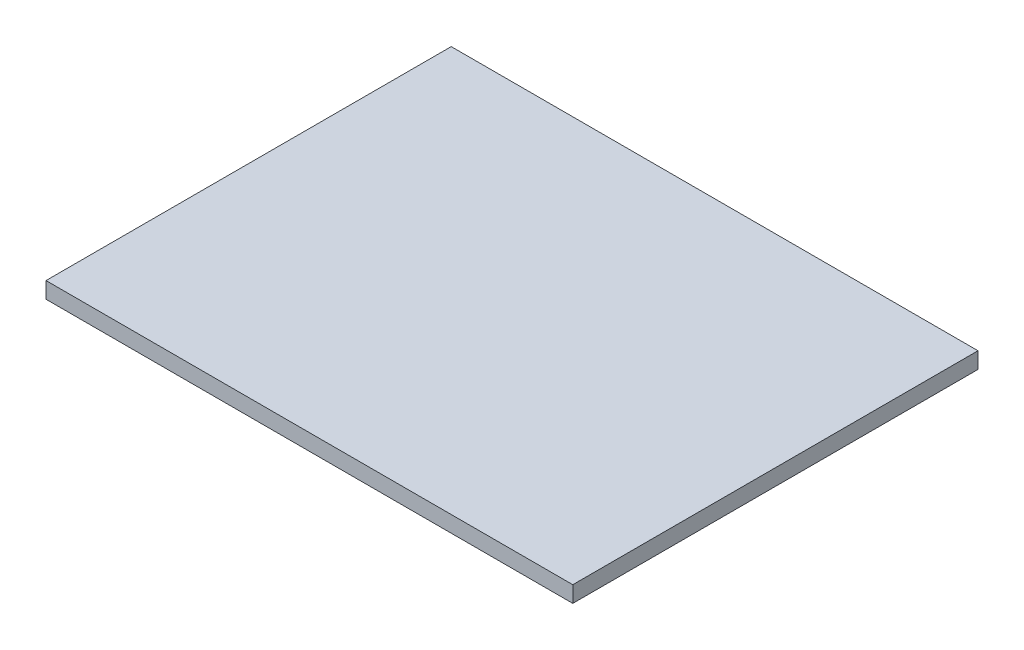
ISO-10303-21;
HEADER;
FILE_DESCRIPTION(('STEP AP214'),'2;1');
FILE_NAME('part.step','',(''),(''),'','','');
FILE_SCHEMA(('AUTOMOTIVE_DESIGN { 1 0 10303 214 1 1 1 1 }'));
ENDSEC;
DATA;
#1=APPLICATION_CONTEXT('core data for automotive mechanical design processes');
#2=APPLICATION_PROTOCOL_DEFINITION('international standard','automotive_design',2000,#1);
#3=PRODUCT_CONTEXT('',#1,'mechanical');
#4=PRODUCT('Part','Part','',(#3));
#5=PRODUCT_RELATED_PRODUCT_CATEGORY('part','',(#4));
#6=PRODUCT_DEFINITION_FORMATION('','',#4);
#7=PRODUCT_DEFINITION_CONTEXT('part definition',#1,'design');
#8=PRODUCT_DEFINITION('design','',#6,#7);
#9=PRODUCT_DEFINITION_SHAPE('','',#8);
#10=(LENGTH_UNIT() NAMED_UNIT(*) SI_UNIT(.MILLI.,.METRE.));
#11=(NAMED_UNIT(*) PLANE_ANGLE_UNIT() SI_UNIT($,.RADIAN.));
#12=(NAMED_UNIT(*) SI_UNIT($,.STERADIAN.) SOLID_ANGLE_UNIT());
#13=UNCERTAINTY_MEASURE_WITH_UNIT(LENGTH_MEASURE(1.E-05),#10,'distance_accuracy_value','');
#14=(GEOMETRIC_REPRESENTATION_CONTEXT(3) GLOBAL_UNCERTAINTY_ASSIGNED_CONTEXT((#13)) GLOBAL_UNIT_ASSIGNED_CONTEXT((#10,
#11,#12)) REPRESENTATION_CONTEXT('',''));
#15=CARTESIAN_POINT('',(0.,0.,0.));
#16=DIRECTION('',(0.,0.,1.));
#17=DIRECTION('',(1.,0.,0.));
#18=AXIS2_PLACEMENT_3D('',#15,#16,#17);
#19=CARTESIAN_POINT('',(162.5,10.,-125.));
#20=DIRECTION('',(-1.,0.,0.));
#21=DIRECTION('',(0.,0.,1.));
#22=AXIS2_PLACEMENT_3D('',#19,#20,#21);
#23=PLANE('',#22);
#24=DIRECTION('',(0.,0.,-1.));
#25=VECTOR('',#24,1.);
#26=CARTESIAN_POINT('',(162.5,0.,-125.));
#27=LINE('',#26,#25);
#28=CARTESIAN_POINT('',(162.5,0.,125.));
#29=VERTEX_POINT('',#28);
#30=CARTESIAN_POINT('',(162.5,0.,-125.));
#31=VERTEX_POINT('',#30);
#32=EDGE_CURVE('E108',#29,#31,#27,.T.);
#33=ORIENTED_EDGE('',*,*,#32,.T.);
#34=DIRECTION('',(0.,-1.,0.));
#35=VECTOR('',#34,1.);
#36=CARTESIAN_POINT('',(162.5,10.,-125.));
#37=LINE('',#36,#35);
#38=CARTESIAN_POINT('',(162.5,10.,-125.));
#39=VERTEX_POINT('',#38);
#40=EDGE_CURVE('E11',#39,#31,#37,.T.);
#41=ORIENTED_EDGE('',*,*,#40,.F.);
#42=DIRECTION('',(0.,0.,-1.));
#43=VECTOR('',#42,1.);
#44=CARTESIAN_POINT('',(162.5,10.,-125.));
#45=LINE('',#44,#43);
#46=CARTESIAN_POINT('',(162.5,10.,125.));
#47=VERTEX_POINT('',#46);
#48=EDGE_CURVE('E96',#47,#39,#45,.T.);
#49=ORIENTED_EDGE('',*,*,#48,.F.);
#50=DIRECTION('',(0.,-1.,0.));
#51=VECTOR('',#50,1.);
#52=CARTESIAN_POINT('',(162.5,10.,125.));
#53=LINE('',#52,#51);
#54=EDGE_CURVE('E104',#47,#29,#53,.T.);
#55=ORIENTED_EDGE('',*,*,#54,.T.);
#56=EDGE_LOOP('',(#33,#41,#49,#55));
#57=FACE_BOUND('',#56,.T.);
#58=ADVANCED_FACE('F45',(#57),#23,.F.);
#59=CARTESIAN_POINT('',(-162.5,10.,-125.));
#60=DIRECTION('',(0.,0.,1.));
#61=DIRECTION('',(1.,0.,0.));
#62=AXIS2_PLACEMENT_3D('',#59,#60,#61);
#63=PLANE('',#62);
#64=DIRECTION('',(-1.,0.,0.));
#65=VECTOR('',#64,1.);
#66=CARTESIAN_POINT('',(-162.5,0.,-125.));
#67=LINE('',#66,#65);
#68=CARTESIAN_POINT('',(-162.5,0.,-125.));
#69=VERTEX_POINT('',#68);
#70=EDGE_CURVE('E100',#31,#69,#67,.T.);
#71=ORIENTED_EDGE('',*,*,#70,.T.);
#72=DIRECTION('',(0.,-1.,0.));
#73=VECTOR('',#72,1.);
#74=CARTESIAN_POINT('',(-162.5,10.,-125.));
#75=LINE('',#74,#73);
#76=CARTESIAN_POINT('',(-162.5,10.,-125.));
#77=VERTEX_POINT('',#76);
#78=EDGE_CURVE('E53',#77,#69,#75,.T.);
#79=ORIENTED_EDGE('',*,*,#78,.F.);
#80=DIRECTION('',(-1.,0.,0.));
#81=VECTOR('',#80,1.);
#82=CARTESIAN_POINT('',(-162.5,10.,-125.));
#83=LINE('',#82,#81);
#84=EDGE_CURVE('E91',#39,#77,#83,.T.);
#85=ORIENTED_EDGE('',*,*,#84,.F.);
#86=ORIENTED_EDGE('',*,*,#40,.T.);
#87=EDGE_LOOP('',(#71,#79,#85,#86));
#88=FACE_BOUND('',#87,.T.);
#89=ADVANCED_FACE('F99',(#88),#63,.F.);
#90=CARTESIAN_POINT('',(-162.5,10.,-125.));
#91=DIRECTION('',(1.,0.,0.));
#92=DIRECTION('',(0.,0.,-1.));
#93=AXIS2_PLACEMENT_3D('',#90,#91,#92);
#94=PLANE('',#93);
#95=DIRECTION('',(0.,0.,1.));
#96=VECTOR('',#95,1.);
#97=CARTESIAN_POINT('',(-162.5,0.,-125.));
#98=LINE('',#97,#96);
#99=CARTESIAN_POINT('',(-162.5,0.,125.));
#100=VERTEX_POINT('',#99);
#101=EDGE_CURVE('E78',#69,#100,#98,.T.);
#102=ORIENTED_EDGE('',*,*,#101,.T.);
#103=DIRECTION('',(0.,-1.,0.));
#104=VECTOR('',#103,1.);
#105=CARTESIAN_POINT('',(-162.5,10.,125.));
#106=LINE('',#105,#104);
#107=CARTESIAN_POINT('',(-162.5,10.,125.));
#108=VERTEX_POINT('',#107);
#109=EDGE_CURVE('E101',#108,#100,#106,.T.);
#110=ORIENTED_EDGE('',*,*,#109,.F.);
#111=DIRECTION('',(0.,0.,1.));
#112=VECTOR('',#111,1.);
#113=CARTESIAN_POINT('',(-162.5,10.,-125.));
#114=LINE('',#113,#112);
#115=EDGE_CURVE('E94',#77,#108,#114,.T.);
#116=ORIENTED_EDGE('',*,*,#115,.F.);
#117=ORIENTED_EDGE('',*,*,#78,.T.);
#118=EDGE_LOOP('',(#102,#110,#116,#117));
#119=FACE_BOUND('',#118,.T.);
#120=ADVANCED_FACE('F102',(#119),#94,.F.);
#121=CARTESIAN_POINT('',(-162.5,10.,125.));
#122=DIRECTION('',(0.,0.,-1.));
#123=DIRECTION('',(-1.,0.,0.));
#124=AXIS2_PLACEMENT_3D('',#121,#122,#123);
#125=PLANE('',#124);
#126=DIRECTION('',(1.,0.,0.));
#127=VECTOR('',#126,1.);
#128=CARTESIAN_POINT('',(-162.5,0.,125.));
#129=LINE('',#128,#127);
#130=EDGE_CURVE('E84',#100,#29,#129,.T.);
#131=ORIENTED_EDGE('',*,*,#130,.T.);
#132=ORIENTED_EDGE('',*,*,#54,.F.);
#133=DIRECTION('',(1.,0.,0.));
#134=VECTOR('',#133,1.);
#135=CARTESIAN_POINT('',(-162.5,10.,125.));
#136=LINE('',#135,#134);
#137=EDGE_CURVE('E61',#108,#47,#136,.T.);
#138=ORIENTED_EDGE('',*,*,#137,.F.);
#139=ORIENTED_EDGE('',*,*,#109,.T.);
#140=EDGE_LOOP('',(#131,#132,#138,#139));
#141=FACE_BOUND('',#140,.T.);
#142=ADVANCED_FACE('F115',(#141),#125,.F.);
#143=CARTESIAN_POINT('',(0.,10.,0.));
#144=DIRECTION('',(0.,1.,0.));
#145=DIRECTION('',(0.,0.,1.));
#146=AXIS2_PLACEMENT_3D('',#143,#144,#145);
#147=PLANE('',#146);
#148=ORIENTED_EDGE('',*,*,#48,.T.);
#149=ORIENTED_EDGE('',*,*,#84,.T.);
#150=ORIENTED_EDGE('',*,*,#115,.T.);
#151=ORIENTED_EDGE('',*,*,#137,.T.);
#152=EDGE_LOOP('',(#148,#149,#150,#151));
#153=FACE_BOUND('',#152,.T.);
#154=ADVANCED_FACE('F92',(#153),#147,.T.);
#155=CARTESIAN_POINT('',(0.,0.,0.));
#156=DIRECTION('',(0.,1.,0.));
#157=DIRECTION('',(0.,0.,1.));
#158=AXIS2_PLACEMENT_3D('',#155,#156,#157);
#159=PLANE('',#158);
#160=ORIENTED_EDGE('',*,*,#32,.F.);
#161=ORIENTED_EDGE('',*,*,#130,.F.);
#162=ORIENTED_EDGE('',*,*,#101,.F.);
#163=ORIENTED_EDGE('',*,*,#70,.F.);
#164=EDGE_LOOP('',(#160,#161,#162,#163));
#165=FACE_BOUND('',#164,.T.);
#166=ADVANCED_FACE('F118',(#165),#159,.F.);
#167=CLOSED_SHELL('',(#58,#89,#120,#142,#154,#166));
#168=MANIFOLD_SOLID_BREP('B2',#167);
#169=ADVANCED_BREP_SHAPE_REPRESENTATION('',(#18,#168),#14);
#170=SHAPE_DEFINITION_REPRESENTATION(#9,#169);
ENDSEC;
END-ISO-10303-21;
